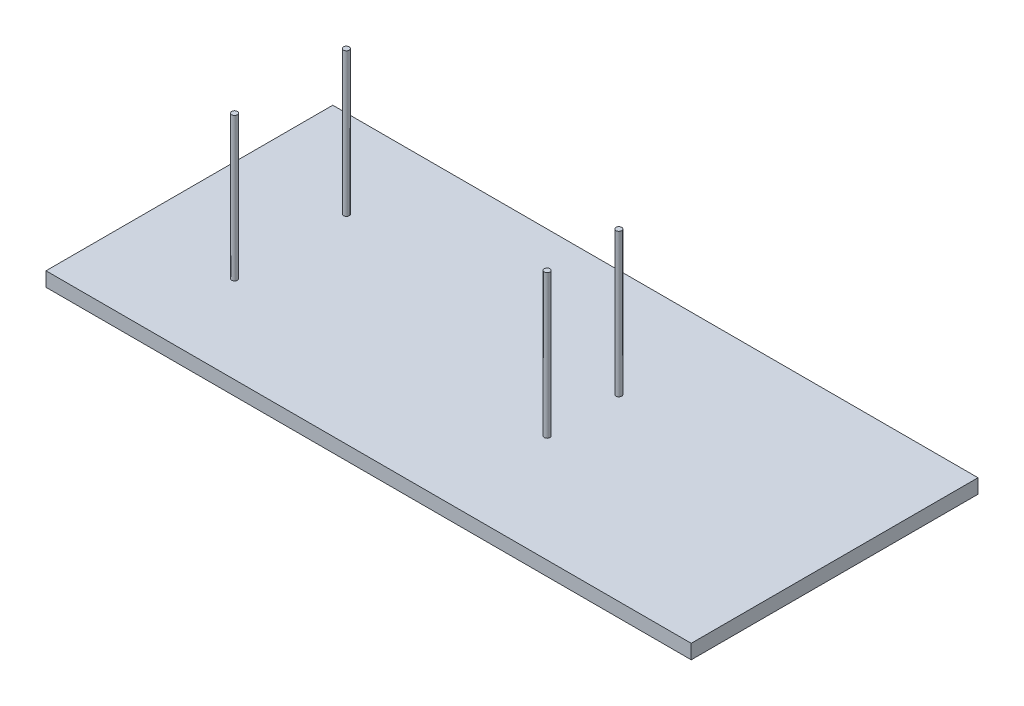
ISO-10303-21;
HEADER;
FILE_DESCRIPTION(('STEP AP214'),'2;1');
FILE_NAME('part.step','',(''),(''),'','','');
FILE_SCHEMA(('AUTOMOTIVE_DESIGN { 1 0 10303 214 1 1 1 1 }'));
ENDSEC;
DATA;
#1=APPLICATION_CONTEXT('core data for automotive mechanical design processes');
#2=APPLICATION_PROTOCOL_DEFINITION('international standard','automotive_design',2000,#1);
#3=PRODUCT_CONTEXT('',#1,'mechanical');
#4=PRODUCT('Part','Part','',(#3));
#5=PRODUCT_RELATED_PRODUCT_CATEGORY('part','',(#4));
#6=PRODUCT_DEFINITION_FORMATION('','',#4);
#7=PRODUCT_DEFINITION_CONTEXT('part definition',#1,'design');
#8=PRODUCT_DEFINITION('design','',#6,#7);
#9=PRODUCT_DEFINITION_SHAPE('','',#8);
#10=(LENGTH_UNIT() NAMED_UNIT(*) SI_UNIT(.MILLI.,.METRE.));
#11=(NAMED_UNIT(*) PLANE_ANGLE_UNIT() SI_UNIT($,.RADIAN.));
#12=(NAMED_UNIT(*) SI_UNIT($,.STERADIAN.) SOLID_ANGLE_UNIT());
#13=UNCERTAINTY_MEASURE_WITH_UNIT(LENGTH_MEASURE(1.E-05),#10,'distance_accuracy_value','');
#14=(GEOMETRIC_REPRESENTATION_CONTEXT(3) GLOBAL_UNCERTAINTY_ASSIGNED_CONTEXT((#13)) GLOBAL_UNIT_ASSIGNED_CONTEXT((#10,
#11,#12)) REPRESENTATION_CONTEXT('',''));
#15=CARTESIAN_POINT('',(0.,0.,0.));
#16=DIRECTION('',(0.,0.,1.));
#17=DIRECTION('',(1.,0.,0.));
#18=AXIS2_PLACEMENT_3D('',#15,#16,#17);
#19=CARTESIAN_POINT('',(0.,0.,0.));
#20=DIRECTION('',(0.,-1.,0.));
#21=DIRECTION('',(0.,0.,-1.));
#22=AXIS2_PLACEMENT_3D('',#19,#20,#21);
#23=PLANE('',#22);
#24=CARTESIAN_POINT('',(74.4999999999999,0.,-25.));
#25=DIRECTION('',(0.,-1.,0.));
#26=DIRECTION('',(0.,0.,-1.));
#27=AXIS2_PLACEMENT_3D('',#24,#25,#26);
#28=CIRCLE('',#27,2.);
#29=CARTESIAN_POINT('',(74.4999999999999,0.,-27.));
#30=VERTEX_POINT('',#29);
#31=EDGE_CURVE('E42',#30,#30,#28,.F.);
#32=ORIENTED_EDGE('',*,*,#31,.F.);
#33=EDGE_LOOP('',(#32));
#34=FACE_BOUND('',#33,.T.);
#35=CARTESIAN_POINT('',(-129.5,0.,-39.));
#36=DIRECTION('',(0.,-1.,0.));
#37=DIRECTION('',(0.,0.,-1.));
#38=AXIS2_PLACEMENT_3D('',#35,#36,#37);
#39=CIRCLE('',#38,2.);
#40=CARTESIAN_POINT('',(-129.5,0.,-41.));
#41=VERTEX_POINT('',#40);
#42=EDGE_CURVE('E92',#41,#41,#39,.F.);
#43=ORIENTED_EDGE('',*,*,#42,.F.);
#44=EDGE_LOOP('',(#43));
#45=FACE_BOUND('',#44,.T.);
#46=DIRECTION('',(1.,0.,0.));
#47=VECTOR('',#46,1.);
#48=CARTESIAN_POINT('',(-300.,0.,100.));
#49=LINE('',#48,#47);
#50=CARTESIAN_POINT('',(-200.,0.,100.));
#51=VERTEX_POINT('',#50);
#52=CARTESIAN_POINT('',(250.,0.,100.));
#53=VERTEX_POINT('',#52);
#54=EDGE_CURVE('E90',#51,#53,#49,.T.);
#55=ORIENTED_EDGE('',*,*,#54,.T.);
#56=DIRECTION('',(0.,0.,1.));
#57=VECTOR('',#56,1.);
#58=CARTESIAN_POINT('',(250.,0.,-100.));
#59=LINE('',#58,#57);
#60=CARTESIAN_POINT('',(250.,0.,-100.));
#61=VERTEX_POINT('',#60);
#62=EDGE_CURVE('E81',#61,#53,#59,.T.);
#63=ORIENTED_EDGE('',*,*,#62,.F.);
#64=DIRECTION('',(-1.,0.,0.));
#65=VECTOR('',#64,1.);
#66=CARTESIAN_POINT('',(-300.,0.,-100.));
#67=LINE('',#66,#65);
#68=CARTESIAN_POINT('',(-200.,0.,-100.));
#69=VERTEX_POINT('',#68);
#70=EDGE_CURVE('E84',#61,#69,#67,.T.);
#71=ORIENTED_EDGE('',*,*,#70,.T.);
#72=DIRECTION('',(0.,0.,-1.));
#73=VECTOR('',#72,1.);
#74=CARTESIAN_POINT('',(-200.,0.,-100.));
#75=LINE('',#74,#73);
#76=EDGE_CURVE('E167',#51,#69,#75,.T.);
#77=ORIENTED_EDGE('',*,*,#76,.F.);
#78=EDGE_LOOP('',(#55,#63,#71,#77));
#79=FACE_BOUND('',#78,.T.);
#80=CARTESIAN_POINT('',(-129.5,0.,39.));
#81=DIRECTION('',(0.,-1.,0.));
#82=DIRECTION('',(0.,0.,-1.));
#83=AXIS2_PLACEMENT_3D('',#80,#81,#82);
#84=CIRCLE('',#83,2.);
#85=CARTESIAN_POINT('',(-129.5,0.,37.));
#86=VERTEX_POINT('',#85);
#87=EDGE_CURVE('E103',#86,#86,#84,.F.);
#88=ORIENTED_EDGE('',*,*,#87,.F.);
#89=EDGE_LOOP('',(#88));
#90=FACE_BOUND('',#89,.T.);
#91=CARTESIAN_POINT('',(74.4999999999999,0.,25.));
#92=DIRECTION('',(0.,-1.,0.));
#93=DIRECTION('',(0.,0.,-1.));
#94=AXIS2_PLACEMENT_3D('',#91,#92,#93);
#95=CIRCLE('',#94,2.);
#96=CARTESIAN_POINT('',(74.4999999999999,0.,23.));
#97=VERTEX_POINT('',#96);
#98=EDGE_CURVE('E11',#97,#97,#95,.F.);
#99=ORIENTED_EDGE('',*,*,#98,.F.);
#100=EDGE_LOOP('',(#99));
#101=FACE_BOUND('',#100,.T.);
#102=ADVANCED_FACE('F34',(#34,#45,#79,#90,#101),#23,.F.);
#103=CARTESIAN_POINT('',(-300.,-10.,100.));
#104=DIRECTION('',(0.,0.,1.));
#105=DIRECTION('',(1.,0.,0.));
#106=AXIS2_PLACEMENT_3D('',#103,#104,#105);
#107=PLANE('',#106);
#108=DIRECTION('',(0.,1.,0.));
#109=VECTOR('',#108,1.);
#110=CARTESIAN_POINT('',(250.,-10.,100.));
#111=LINE('',#110,#109);
#112=CARTESIAN_POINT('',(250.,-10.,100.));
#113=VERTEX_POINT('',#112);
#114=EDGE_CURVE('E49',#113,#53,#111,.T.);
#115=ORIENTED_EDGE('',*,*,#114,.T.);
#116=ORIENTED_EDGE('',*,*,#54,.F.);
#117=DIRECTION('',(0.,1.,0.));
#118=VECTOR('',#117,1.);
#119=CARTESIAN_POINT('',(-200.,-10.,100.));
#120=LINE('',#119,#118);
#121=CARTESIAN_POINT('',(-200.,-10.,100.));
#122=VERTEX_POINT('',#121);
#123=EDGE_CURVE('E173',#122,#51,#120,.T.);
#124=ORIENTED_EDGE('',*,*,#123,.F.);
#125=DIRECTION('',(1.,0.,0.));
#126=VECTOR('',#125,1.);
#127=CARTESIAN_POINT('',(-300.,-10.,100.));
#128=LINE('',#127,#126);
#129=EDGE_CURVE('E89',#122,#113,#128,.T.);
#130=ORIENTED_EDGE('',*,*,#129,.T.);
#131=EDGE_LOOP('',(#115,#116,#124,#130));
#132=FACE_BOUND('',#131,.T.);
#133=ADVANCED_FACE('F112',(#132),#107,.T.);
#134=CARTESIAN_POINT('',(-300.,-10.,-100.));
#135=DIRECTION('',(0.,0.,-1.));
#136=DIRECTION('',(-1.,0.,0.));
#137=AXIS2_PLACEMENT_3D('',#134,#135,#136);
#138=PLANE('',#137);
#139=DIRECTION('',(0.,1.,0.));
#140=VECTOR('',#139,1.);
#141=CARTESIAN_POINT('',(250.,-10.,-100.));
#142=LINE('',#141,#140);
#143=CARTESIAN_POINT('',(250.,-10.,-100.));
#144=VERTEX_POINT('',#143);
#145=EDGE_CURVE('E76',#144,#61,#142,.T.);
#146=ORIENTED_EDGE('',*,*,#145,.F.);
#147=DIRECTION('',(-1.,0.,0.));
#148=VECTOR('',#147,1.);
#149=CARTESIAN_POINT('',(-300.,-10.,-100.));
#150=LINE('',#149,#148);
#151=CARTESIAN_POINT('',(-200.,-10.,-100.));
#152=VERTEX_POINT('',#151);
#153=EDGE_CURVE('E57',#144,#152,#150,.T.);
#154=ORIENTED_EDGE('',*,*,#153,.T.);
#155=DIRECTION('',(0.,1.,0.));
#156=VECTOR('',#155,1.);
#157=CARTESIAN_POINT('',(-200.,-10.,-100.));
#158=LINE('',#157,#156);
#159=EDGE_CURVE('E175',#152,#69,#158,.T.);
#160=ORIENTED_EDGE('',*,*,#159,.T.);
#161=ORIENTED_EDGE('',*,*,#70,.F.);
#162=EDGE_LOOP('',(#146,#154,#160,#161));
#163=FACE_BOUND('',#162,.T.);
#164=ADVANCED_FACE('F36',(#163),#138,.T.);
#165=CARTESIAN_POINT('',(0.,-10.,0.));
#166=DIRECTION('',(0.,-1.,0.));
#167=DIRECTION('',(0.,0.,-1.));
#168=AXIS2_PLACEMENT_3D('',#165,#166,#167);
#169=PLANE('',#168);
#170=DIRECTION('',(0.,0.,1.));
#171=VECTOR('',#170,1.);
#172=CARTESIAN_POINT('',(250.,-10.,-100.));
#173=LINE('',#172,#171);
#174=EDGE_CURVE('E74',#144,#113,#173,.T.);
#175=ORIENTED_EDGE('',*,*,#174,.T.);
#176=ORIENTED_EDGE('',*,*,#129,.F.);
#177=DIRECTION('',(0.,0.,-1.));
#178=VECTOR('',#177,1.);
#179=CARTESIAN_POINT('',(-200.,-10.,-100.));
#180=LINE('',#179,#178);
#181=EDGE_CURVE('E88',#122,#152,#180,.T.);
#182=ORIENTED_EDGE('',*,*,#181,.T.);
#183=ORIENTED_EDGE('',*,*,#153,.F.);
#184=EDGE_LOOP('',(#175,#176,#182,#183));
#185=FACE_BOUND('',#184,.T.);
#186=ADVANCED_FACE('F87',(#185),#169,.T.);
#187=CARTESIAN_POINT('',(-129.5,100.,-39.));
#188=DIRECTION('',(0.,-1.,0.));
#189=DIRECTION('',(0.,0.,-1.));
#190=AXIS2_PLACEMENT_3D('',#187,#188,#189);
#191=CYLINDRICAL_SURFACE('',#190,2.);
#192=CARTESIAN_POINT('',(-129.5,100.,-39.));
#193=DIRECTION('',(0.,1.,0.));
#194=DIRECTION('',(0.,0.,1.));
#195=AXIS2_PLACEMENT_3D('',#192,#193,#194);
#196=CIRCLE('',#195,2.);
#197=CARTESIAN_POINT('',(-129.5,100.,-37.));
#198=VERTEX_POINT('',#197);
#199=EDGE_CURVE('E97',#198,#198,#196,.T.);
#200=ORIENTED_EDGE('',*,*,#199,.F.);
#201=EDGE_LOOP('',(#200));
#202=FACE_BOUND('',#201,.T.);
#203=ORIENTED_EDGE('',*,*,#42,.T.);
#204=EDGE_LOOP('',(#203));
#205=FACE_BOUND('',#204,.T.);
#206=ADVANCED_FACE('F155',(#202,#205),#191,.T.);
#207=CARTESIAN_POINT('',(-129.5,100.,-39.));
#208=DIRECTION('',(0.,1.,0.));
#209=DIRECTION('',(0.,0.,1.));
#210=AXIS2_PLACEMENT_3D('',#207,#208,#209);
#211=PLANE('',#210);
#212=ORIENTED_EDGE('',*,*,#199,.T.);
#213=EDGE_LOOP('',(#212));
#214=FACE_BOUND('',#213,.T.);
#215=ADVANCED_FACE('F151',(#214),#211,.T.);
#216=CARTESIAN_POINT('',(-129.5,100.,39.));
#217=DIRECTION('',(0.,-1.,0.));
#218=DIRECTION('',(0.,0.,-1.));
#219=AXIS2_PLACEMENT_3D('',#216,#217,#218);
#220=CYLINDRICAL_SURFACE('',#219,2.);
#221=CARTESIAN_POINT('',(-129.5,100.,39.));
#222=DIRECTION('',(0.,1.,0.));
#223=DIRECTION('',(0.,0.,-1.));
#224=AXIS2_PLACEMENT_3D('',#221,#222,#223);
#225=CIRCLE('',#224,2.);
#226=CARTESIAN_POINT('',(-129.5,100.,37.));
#227=VERTEX_POINT('',#226);
#228=EDGE_CURVE('E183',#227,#227,#225,.T.);
#229=ORIENTED_EDGE('',*,*,#228,.F.);
#230=EDGE_LOOP('',(#229));
#231=FACE_BOUND('',#230,.T.);
#232=ORIENTED_EDGE('',*,*,#87,.T.);
#233=EDGE_LOOP('',(#232));
#234=FACE_BOUND('',#233,.T.);
#235=ADVANCED_FACE('F147',(#231,#234),#220,.T.);
#236=CARTESIAN_POINT('',(-129.5,100.,39.));
#237=DIRECTION('',(0.,-1.,0.));
#238=DIRECTION('',(0.,0.,-1.));
#239=AXIS2_PLACEMENT_3D('',#236,#237,#238);
#240=PLANE('',#239);
#241=ORIENTED_EDGE('',*,*,#228,.T.);
#242=EDGE_LOOP('',(#241));
#243=FACE_BOUND('',#242,.T.);
#244=ADVANCED_FACE('F143',(#243),#240,.F.);
#245=CARTESIAN_POINT('',(74.4999999999999,100.,-25.));
#246=DIRECTION('',(0.,-1.,0.));
#247=DIRECTION('',(0.,0.,-1.));
#248=AXIS2_PLACEMENT_3D('',#245,#246,#247);
#249=CYLINDRICAL_SURFACE('',#248,2.);
#250=CARTESIAN_POINT('',(74.4999999999999,100.,-25.));
#251=DIRECTION('',(0.,1.,0.));
#252=DIRECTION('',(0.,0.,1.));
#253=AXIS2_PLACEMENT_3D('',#250,#251,#252);
#254=CIRCLE('',#253,2.);
#255=CARTESIAN_POINT('',(74.4999999999999,100.,-23.));
#256=VERTEX_POINT('',#255);
#257=EDGE_CURVE('E181',#256,#256,#254,.T.);
#258=ORIENTED_EDGE('',*,*,#257,.F.);
#259=EDGE_LOOP('',(#258));
#260=FACE_BOUND('',#259,.T.);
#261=ORIENTED_EDGE('',*,*,#31,.T.);
#262=EDGE_LOOP('',(#261));
#263=FACE_BOUND('',#262,.T.);
#264=ADVANCED_FACE('F108',(#260,#263),#249,.T.);
#265=CARTESIAN_POINT('',(74.4999999999999,100.,-25.));
#266=DIRECTION('',(0.,1.,0.));
#267=DIRECTION('',(0.,0.,1.));
#268=AXIS2_PLACEMENT_3D('',#265,#266,#267);
#269=PLANE('',#268);
#270=ORIENTED_EDGE('',*,*,#257,.T.);
#271=EDGE_LOOP('',(#270));
#272=FACE_BOUND('',#271,.T.);
#273=ADVANCED_FACE('F126',(#272),#269,.T.);
#274=CARTESIAN_POINT('',(74.4999999999999,100.,25.));
#275=DIRECTION('',(0.,-1.,0.));
#276=DIRECTION('',(0.,0.,-1.));
#277=AXIS2_PLACEMENT_3D('',#274,#275,#276);
#278=CYLINDRICAL_SURFACE('',#277,2.);
#279=CARTESIAN_POINT('',(74.4999999999999,100.,25.));
#280=DIRECTION('',(0.,1.,0.));
#281=DIRECTION('',(0.,0.,-1.));
#282=AXIS2_PLACEMENT_3D('',#279,#280,#281);
#283=CIRCLE('',#282,2.);
#284=CARTESIAN_POINT('',(74.4999999999999,100.,23.));
#285=VERTEX_POINT('',#284);
#286=EDGE_CURVE('E177',#285,#285,#283,.T.);
#287=ORIENTED_EDGE('',*,*,#286,.F.);
#288=EDGE_LOOP('',(#287));
#289=FACE_BOUND('',#288,.T.);
#290=ORIENTED_EDGE('',*,*,#98,.T.);
#291=EDGE_LOOP('',(#290));
#292=FACE_BOUND('',#291,.T.);
#293=ADVANCED_FACE('F123',(#289,#292),#278,.T.);
#294=CARTESIAN_POINT('',(74.4999999999999,100.,25.));
#295=DIRECTION('',(0.,-1.,0.));
#296=DIRECTION('',(0.,0.,-1.));
#297=AXIS2_PLACEMENT_3D('',#294,#295,#296);
#298=PLANE('',#297);
#299=ORIENTED_EDGE('',*,*,#286,.T.);
#300=EDGE_LOOP('',(#299));
#301=FACE_BOUND('',#300,.T.);
#302=ADVANCED_FACE('F125',(#301),#298,.F.);
#303=CARTESIAN_POINT('',(-200.,-10.,-100.));
#304=DIRECTION('',(1.,0.,0.));
#305=DIRECTION('',(0.,0.,-1.));
#306=AXIS2_PLACEMENT_3D('',#303,#304,#305);
#307=PLANE('',#306);
#308=ORIENTED_EDGE('',*,*,#76,.T.);
#309=ORIENTED_EDGE('',*,*,#159,.F.);
#310=ORIENTED_EDGE('',*,*,#181,.F.);
#311=ORIENTED_EDGE('',*,*,#123,.T.);
#312=EDGE_LOOP('',(#308,#309,#310,#311));
#313=FACE_BOUND('',#312,.T.);
#314=ADVANCED_FACE('F133',(#313),#307,.F.);
#315=CARTESIAN_POINT('',(250.,-10.,-100.));
#316=DIRECTION('',(-1.,0.,0.));
#317=DIRECTION('',(0.,0.,1.));
#318=AXIS2_PLACEMENT_3D('',#315,#316,#317);
#319=PLANE('',#318);
#320=ORIENTED_EDGE('',*,*,#62,.T.);
#321=ORIENTED_EDGE('',*,*,#114,.F.);
#322=ORIENTED_EDGE('',*,*,#174,.F.);
#323=ORIENTED_EDGE('',*,*,#145,.T.);
#324=EDGE_LOOP('',(#320,#321,#322,#323));
#325=FACE_BOUND('',#324,.T.);
#326=ADVANCED_FACE('F75',(#325),#319,.F.);
#327=CLOSED_SHELL('',(#102,#133,#164,#186,#206,#215,#235,#244,#264,#273,#293,#302,#314,#326));
#328=MANIFOLD_SOLID_BREP('B2',#327);
#329=ADVANCED_BREP_SHAPE_REPRESENTATION('',(#18,#328),#14);
#330=SHAPE_DEFINITION_REPRESENTATION(#9,#329);
ENDSEC;
END-ISO-10303-21;
